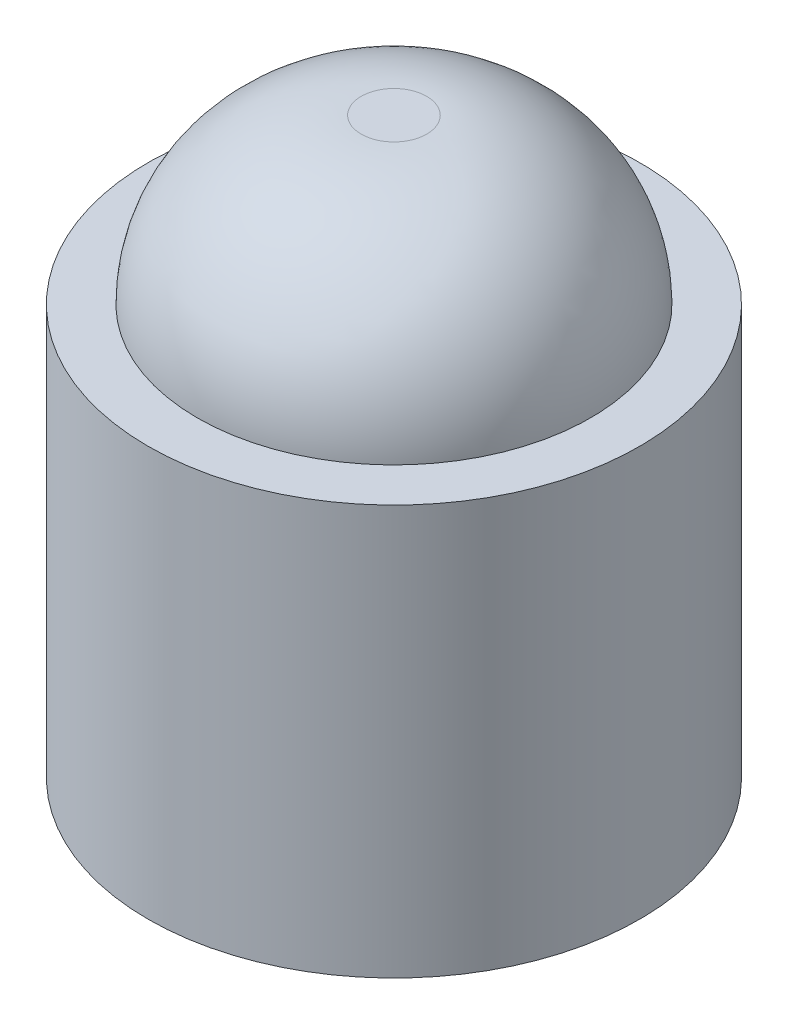
ISO-10303-21;
HEADER;
FILE_DESCRIPTION(('STEP AP214'),'2;1');
FILE_NAME('part.step','',(''),(''),'','','');
FILE_SCHEMA(('AUTOMOTIVE_DESIGN { 1 0 10303 214 1 1 1 1 }'));
ENDSEC;
DATA;
#1=APPLICATION_CONTEXT('core data for automotive mechanical design processes');
#2=APPLICATION_PROTOCOL_DEFINITION('international standard','automotive_design',2000,#1);
#3=PRODUCT_CONTEXT('',#1,'mechanical');
#4=PRODUCT('Part','Part','',(#3));
#5=PRODUCT_RELATED_PRODUCT_CATEGORY('part','',(#4));
#6=PRODUCT_DEFINITION_FORMATION('','',#4);
#7=PRODUCT_DEFINITION_CONTEXT('part definition',#1,'design');
#8=PRODUCT_DEFINITION('design','',#6,#7);
#9=PRODUCT_DEFINITION_SHAPE('','',#8);
#10=(LENGTH_UNIT() NAMED_UNIT(*) SI_UNIT(.MILLI.,.METRE.));
#11=(NAMED_UNIT(*) PLANE_ANGLE_UNIT() SI_UNIT($,.RADIAN.));
#12=(NAMED_UNIT(*) SI_UNIT($,.STERADIAN.) SOLID_ANGLE_UNIT());
#13=UNCERTAINTY_MEASURE_WITH_UNIT(LENGTH_MEASURE(1.E-05),#10,'distance_accuracy_value','');
#14=(GEOMETRIC_REPRESENTATION_CONTEXT(3) GLOBAL_UNCERTAINTY_ASSIGNED_CONTEXT((#13)) GLOBAL_UNIT_ASSIGNED_CONTEXT((#10,
#11,#12)) REPRESENTATION_CONTEXT('',''));
#15=CARTESIAN_POINT('',(0.,0.,0.));
#16=DIRECTION('',(0.,0.,1.));
#17=DIRECTION('',(1.,0.,0.));
#18=AXIS2_PLACEMENT_3D('',#15,#16,#17);
#19=CARTESIAN_POINT('',(0.,25.,0.));
#20=DIRECTION('',(0.,-1.,0.));
#21=DIRECTION('',(0.,0.,-1.));
#22=AXIS2_PLACEMENT_3D('',#19,#20,#21);
#23=CYLINDRICAL_SURFACE('',#22,15.);
#24=CARTESIAN_POINT('',(0.,25.,0.));
#25=DIRECTION('',(0.,1.,0.));
#26=DIRECTION('',(0.,0.,1.));
#27=AXIS2_PLACEMENT_3D('',#24,#25,#26);
#28=CIRCLE('',#27,15.);
#29=CARTESIAN_POINT('',(0.,25.,15.));
#30=VERTEX_POINT('',#29);
#31=EDGE_CURVE('E44',#30,#30,#28,.T.);
#32=ORIENTED_EDGE('',*,*,#31,.F.);
#33=EDGE_LOOP('',(#32));
#34=FACE_BOUND('',#33,.T.);
#35=CARTESIAN_POINT('',(0.,0.,0.));
#36=DIRECTION('',(0.,1.,0.));
#37=DIRECTION('',(0.,0.,1.));
#38=AXIS2_PLACEMENT_3D('',#35,#36,#37);
#39=CIRCLE('',#38,15.);
#40=CARTESIAN_POINT('',(0.,0.,15.));
#41=VERTEX_POINT('',#40);
#42=EDGE_CURVE('E48',#41,#41,#39,.T.);
#43=ORIENTED_EDGE('',*,*,#42,.T.);
#44=EDGE_LOOP('',(#43));
#45=FACE_BOUND('',#44,.T.);
#46=ADVANCED_FACE('F37',(#34,#45),#23,.T.);
#47=CARTESIAN_POINT('',(0.,25.,0.));
#48=DIRECTION('',(0.,1.,0.));
#49=DIRECTION('',(0.,0.,1.));
#50=AXIS2_PLACEMENT_3D('',#47,#48,#49);
#51=PLANE('',#50);
#52=CARTESIAN_POINT('',(0.,25.,0.));
#53=DIRECTION('',(0.,1.,0.));
#54=DIRECTION('',(0.,0.,1.));
#55=AXIS2_PLACEMENT_3D('',#52,#53,#54);
#56=CIRCLE('',#55,12.);
#57=CARTESIAN_POINT('',(0.,25.,12.));
#58=VERTEX_POINT('',#57);
#59=EDGE_CURVE('E53',#58,#58,#56,.T.);
#60=ORIENTED_EDGE('',*,*,#59,.F.);
#61=EDGE_LOOP('',(#60));
#62=FACE_BOUND('',#61,.T.);
#63=ORIENTED_EDGE('',*,*,#31,.T.);
#64=EDGE_LOOP('',(#63));
#65=FACE_BOUND('',#64,.T.);
#66=ADVANCED_FACE('F60',(#62,#65),#51,.T.);
#67=CARTESIAN_POINT('',(0.,0.,0.));
#68=DIRECTION('',(0.,1.,0.));
#69=DIRECTION('',(0.,0.,1.));
#70=AXIS2_PLACEMENT_3D('',#67,#68,#69);
#71=PLANE('',#70);
#72=ORIENTED_EDGE('',*,*,#42,.F.);
#73=EDGE_LOOP('',(#72));
#74=FACE_BOUND('',#73,.T.);
#75=ADVANCED_FACE('F62',(#74),#71,.F.);
#76=CARTESIAN_POINT('',(0.,35.,0.));
#77=DIRECTION('',(0.,1.,0.));
#78=DIRECTION('',(0.,0.,1.));
#79=AXIS2_PLACEMENT_3D('',#76,#77,#78);
#80=PLANE('',#79);
#81=CARTESIAN_POINT('',(0.,35.,0.));
#82=DIRECTION('',(0.,1.,0.));
#83=DIRECTION('',(0.,0.,1.));
#84=AXIS2_PLACEMENT_3D('',#81,#82,#83);
#85=CIRCLE('',#84,2.);
#86=CARTESIAN_POINT('',(0.,35.,2.));
#87=VERTEX_POINT('',#86);
#88=EDGE_CURVE('E10',#87,#87,#85,.T.);
#89=ORIENTED_EDGE('',*,*,#88,.T.);
#90=EDGE_LOOP('',(#89));
#91=FACE_BOUND('',#90,.T.);
#92=ADVANCED_FACE('F68',(#91),#80,.T.);
#93=CARTESIAN_POINT('',(0.,25.,0.));
#94=DIRECTION('',(0.,1.,0.));
#95=DIRECTION('',(0.,0.,1.));
#96=AXIS2_PLACEMENT_3D('',#93,#94,#95);
#97=DEGENERATE_TOROIDAL_SURFACE('',#96,2.,10.,.T.);
#98=ORIENTED_EDGE('',*,*,#59,.T.);
#99=EDGE_LOOP('',(#98));
#100=FACE_BOUND('',#99,.T.);
#101=ORIENTED_EDGE('',*,*,#88,.F.);
#102=EDGE_LOOP('',(#101));
#103=FACE_BOUND('',#102,.T.);
#104=ADVANCED_FACE('F39',(#100,#103),#97,.T.);
#105=CLOSED_SHELL('',(#46,#66,#75,#92,#104));
#106=MANIFOLD_SOLID_BREP('B2',#105);
#107=ADVANCED_BREP_SHAPE_REPRESENTATION('',(#18,#106),#14);
#108=SHAPE_DEFINITION_REPRESENTATION(#9,#107);
ENDSEC;
END-ISO-10303-21;
